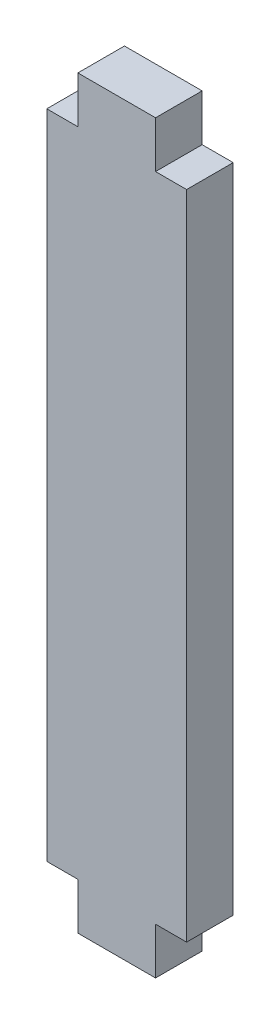
ISO-10303-21;
HEADER;
FILE_DESCRIPTION(('STEP AP214'),'2;1');
FILE_NAME('part.step','',(''),(''),'','','');
FILE_SCHEMA(('AUTOMOTIVE_DESIGN { 1 0 10303 214 1 1 1 1 }'));
ENDSEC;
DATA;
#1=APPLICATION_CONTEXT('core data for automotive mechanical design processes');
#2=APPLICATION_PROTOCOL_DEFINITION('international standard','automotive_design',2000,#1);
#3=PRODUCT_CONTEXT('',#1,'mechanical');
#4=PRODUCT('Part','Part','',(#3));
#5=PRODUCT_RELATED_PRODUCT_CATEGORY('part','',(#4));
#6=PRODUCT_DEFINITION_FORMATION('','',#4);
#7=PRODUCT_DEFINITION_CONTEXT('part definition',#1,'design');
#8=PRODUCT_DEFINITION('design','',#6,#7);
#9=PRODUCT_DEFINITION_SHAPE('','',#8);
#10=(LENGTH_UNIT() NAMED_UNIT(*) SI_UNIT(.MILLI.,.METRE.));
#11=(NAMED_UNIT(*) PLANE_ANGLE_UNIT() SI_UNIT($,.RADIAN.));
#12=(NAMED_UNIT(*) SI_UNIT($,.STERADIAN.) SOLID_ANGLE_UNIT());
#13=UNCERTAINTY_MEASURE_WITH_UNIT(LENGTH_MEASURE(1.E-05),#10,'distance_accuracy_value','');
#14=(GEOMETRIC_REPRESENTATION_CONTEXT(3) GLOBAL_UNCERTAINTY_ASSIGNED_CONTEXT((#13)) GLOBAL_UNIT_ASSIGNED_CONTEXT((#10,
#11,#12)) REPRESENTATION_CONTEXT('',''));
#15=CARTESIAN_POINT('',(0.,0.,0.));
#16=DIRECTION('',(0.,0.,1.));
#17=DIRECTION('',(1.,0.,0.));
#18=AXIS2_PLACEMENT_3D('',#15,#16,#17);
#19=CARTESIAN_POINT('',(0.,-20.975,3.));
#20=DIRECTION('',(0.,-1.,0.));
#21=DIRECTION('',(0.,0.,-1.));
#22=AXIS2_PLACEMENT_3D('',#19,#20,#21);
#23=PLANE('',#22);
#24=DIRECTION('',(-1.,0.,0.));
#25=VECTOR('',#24,1.);
#26=CARTESIAN_POINT('',(0.,-20.975,0.));
#27=LINE('',#26,#25);
#28=CARTESIAN_POINT('',(4.5,-20.975,0.));
#29=VERTEX_POINT('',#28);
#30=CARTESIAN_POINT('',(2.49999999999993,-20.975,0.));
#31=VERTEX_POINT('',#30);
#32=EDGE_CURVE('E206',#29,#31,#27,.T.);
#33=ORIENTED_EDGE('',*,*,#32,.F.);
#34=DIRECTION('',(0.,0.,-1.));
#35=VECTOR('',#34,1.);
#36=CARTESIAN_POINT('',(4.5,-20.975,3.));
#37=LINE('',#36,#35);
#38=CARTESIAN_POINT('',(4.5,-20.975,3.));
#39=VERTEX_POINT('',#38);
#40=EDGE_CURVE('E229',#39,#29,#37,.T.);
#41=ORIENTED_EDGE('',*,*,#40,.F.);
#42=DIRECTION('',(-1.,0.,0.));
#43=VECTOR('',#42,1.);
#44=CARTESIAN_POINT('',(0.,-20.975,3.));
#45=LINE('',#44,#43);
#46=CARTESIAN_POINT('',(2.49999999999993,-20.975,3.));
#47=VERTEX_POINT('',#46);
#48=EDGE_CURVE('E311',#39,#47,#45,.T.);
#49=ORIENTED_EDGE('',*,*,#48,.T.);
#50=DIRECTION('',(0.,0.,-1.));
#51=VECTOR('',#50,1.);
#52=CARTESIAN_POINT('',(2.49999999999993,-20.975,3.));
#53=LINE('',#52,#51);
#54=EDGE_CURVE('E233',#47,#31,#53,.T.);
#55=ORIENTED_EDGE('',*,*,#54,.T.);
#56=EDGE_LOOP('',(#33,#41,#49,#55));
#57=FACE_BOUND('',#56,.T.);
#58=ADVANCED_FACE('F77',(#57),#23,.T.);
#59=CARTESIAN_POINT('',(2.5,0.,3.));
#60=DIRECTION('',(-1.,0.,0.));
#61=DIRECTION('',(0.,-1.,0.));
#62=AXIS2_PLACEMENT_3D('',#59,#60,#61);
#63=PLANE('',#62);
#64=DIRECTION('',(0.,1.,0.));
#65=VECTOR('',#64,1.);
#66=CARTESIAN_POINT('',(2.5,0.,0.));
#67=LINE('',#66,#65);
#68=CARTESIAN_POINT('',(2.49999999999992,-23.975,0.));
#69=VERTEX_POINT('',#68);
#70=EDGE_CURVE('E214',#69,#31,#67,.T.);
#71=ORIENTED_EDGE('',*,*,#70,.T.);
#72=ORIENTED_EDGE('',*,*,#54,.F.);
#73=DIRECTION('',(0.,1.,0.));
#74=VECTOR('',#73,1.);
#75=CARTESIAN_POINT('',(2.5,0.,3.));
#76=LINE('',#75,#74);
#77=CARTESIAN_POINT('',(2.49999999999992,-23.975,3.));
#78=VERTEX_POINT('',#77);
#79=EDGE_CURVE('E315',#78,#47,#76,.T.);
#80=ORIENTED_EDGE('',*,*,#79,.F.);
#81=DIRECTION('',(0.,0.,-1.));
#82=VECTOR('',#81,1.);
#83=CARTESIAN_POINT('',(2.49999999999992,-23.975,3.));
#84=LINE('',#83,#82);
#85=EDGE_CURVE('E237',#78,#69,#84,.T.);
#86=ORIENTED_EDGE('',*,*,#85,.T.);
#87=EDGE_LOOP('',(#71,#72,#80,#86));
#88=FACE_BOUND('',#87,.T.);
#89=ADVANCED_FACE('F269',(#88),#63,.F.);
#90=CARTESIAN_POINT('',(0.,-23.975,3.));
#91=DIRECTION('',(0.,-1.,0.));
#92=DIRECTION('',(1.,0.,0.));
#93=AXIS2_PLACEMENT_3D('',#90,#91,#92);
#94=PLANE('',#93);
#95=DIRECTION('',(-1.,0.,0.));
#96=VECTOR('',#95,1.);
#97=CARTESIAN_POINT('',(0.,-23.975,0.));
#98=LINE('',#97,#96);
#99=CARTESIAN_POINT('',(-2.50000000000008,-23.975,0.));
#100=VERTEX_POINT('',#99);
#101=EDGE_CURVE('E210',#69,#100,#98,.T.);
#102=ORIENTED_EDGE('',*,*,#101,.F.);
#103=ORIENTED_EDGE('',*,*,#85,.F.);
#104=DIRECTION('',(-1.,0.,0.));
#105=VECTOR('',#104,1.);
#106=CARTESIAN_POINT('',(0.,-23.975,3.));
#107=LINE('',#106,#105);
#108=CARTESIAN_POINT('',(-2.50000000000008,-23.975,3.));
#109=VERTEX_POINT('',#108);
#110=EDGE_CURVE('E253',#78,#109,#107,.T.);
#111=ORIENTED_EDGE('',*,*,#110,.T.);
#112=DIRECTION('',(0.,0.,-1.));
#113=VECTOR('',#112,1.);
#114=CARTESIAN_POINT('',(-2.50000000000008,-23.975,3.));
#115=LINE('',#114,#113);
#116=EDGE_CURVE('E164',#109,#100,#115,.T.);
#117=ORIENTED_EDGE('',*,*,#116,.T.);
#118=EDGE_LOOP('',(#102,#103,#111,#117));
#119=FACE_BOUND('',#118,.T.);
#120=ADVANCED_FACE('F248',(#119),#94,.T.);
#121=CARTESIAN_POINT('',(-2.5,0.,3.));
#122=DIRECTION('',(-1.,0.,0.));
#123=DIRECTION('',(0.,-1.,0.));
#124=AXIS2_PLACEMENT_3D('',#121,#122,#123);
#125=PLANE('',#124);
#126=DIRECTION('',(0.,1.,0.));
#127=VECTOR('',#126,1.);
#128=CARTESIAN_POINT('',(-2.5,0.,0.));
#129=LINE('',#128,#127);
#130=CARTESIAN_POINT('',(-2.50000000000007,-20.975,0.));
#131=VERTEX_POINT('',#130);
#132=EDGE_CURVE('E205',#100,#131,#129,.T.);
#133=ORIENTED_EDGE('',*,*,#132,.F.);
#134=ORIENTED_EDGE('',*,*,#116,.F.);
#135=DIRECTION('',(0.,1.,0.));
#136=VECTOR('',#135,1.);
#137=CARTESIAN_POINT('',(-2.5,0.,3.));
#138=LINE('',#137,#136);
#139=CARTESIAN_POINT('',(-2.50000000000007,-20.975,3.));
#140=VERTEX_POINT('',#139);
#141=EDGE_CURVE('E309',#109,#140,#138,.T.);
#142=ORIENTED_EDGE('',*,*,#141,.T.);
#143=DIRECTION('',(0.,0.,-1.));
#144=VECTOR('',#143,1.);
#145=CARTESIAN_POINT('',(-2.50000000000007,-20.975,3.));
#146=LINE('',#145,#144);
#147=EDGE_CURVE('E155',#140,#131,#146,.T.);
#148=ORIENTED_EDGE('',*,*,#147,.T.);
#149=EDGE_LOOP('',(#133,#134,#142,#148));
#150=FACE_BOUND('',#149,.T.);
#151=ADVANCED_FACE('F259',(#150),#125,.T.);
#152=CARTESIAN_POINT('',(-4.5,-20.975,0.));
#153=VERTEX_POINT('',#152);
#154=EDGE_CURVE('E201',#131,#153,#27,.T.);
#155=ORIENTED_EDGE('',*,*,#154,.F.);
#156=ORIENTED_EDGE('',*,*,#147,.F.);
#157=CARTESIAN_POINT('',(-4.5,-20.975,3.));
#158=VERTEX_POINT('',#157);
#159=EDGE_CURVE('E304',#140,#158,#45,.T.);
#160=ORIENTED_EDGE('',*,*,#159,.T.);
#161=DIRECTION('',(0.,0.,-1.));
#162=VECTOR('',#161,1.);
#163=CARTESIAN_POINT('',(-4.5,-20.975,3.));
#164=LINE('',#163,#162);
#165=EDGE_CURVE('E149',#158,#153,#164,.T.);
#166=ORIENTED_EDGE('',*,*,#165,.T.);
#167=EDGE_LOOP('',(#155,#156,#160,#166));
#168=FACE_BOUND('',#167,.T.);
#169=ADVANCED_FACE('F307',(#168),#23,.T.);
#170=CARTESIAN_POINT('',(4.5,0.,3.));
#171=DIRECTION('',(-1.,0.,0.));
#172=DIRECTION('',(0.,0.,1.));
#173=AXIS2_PLACEMENT_3D('',#170,#171,#172);
#174=PLANE('',#173);
#175=DIRECTION('',(0.,1.,0.));
#176=VECTOR('',#175,1.);
#177=CARTESIAN_POINT('',(4.5,0.,0.));
#178=LINE('',#177,#176);
#179=CARTESIAN_POINT('',(4.5,20.975,0.));
#180=VERTEX_POINT('',#179);
#181=EDGE_CURVE('E218',#29,#180,#178,.T.);
#182=ORIENTED_EDGE('',*,*,#181,.T.);
#183=DIRECTION('',(0.,0.,-1.));
#184=VECTOR('',#183,1.);
#185=CARTESIAN_POINT('',(4.5,20.975,3.));
#186=LINE('',#185,#184);
#187=CARTESIAN_POINT('',(4.5,20.975,3.));
#188=VERTEX_POINT('',#187);
#189=EDGE_CURVE('E192',#188,#180,#186,.T.);
#190=ORIENTED_EDGE('',*,*,#189,.F.);
#191=DIRECTION('',(0.,1.,0.));
#192=VECTOR('',#191,1.);
#193=CARTESIAN_POINT('',(4.5,0.,3.));
#194=LINE('',#193,#192);
#195=EDGE_CURVE('E181',#39,#188,#194,.T.);
#196=ORIENTED_EDGE('',*,*,#195,.F.);
#197=ORIENTED_EDGE('',*,*,#40,.T.);
#198=EDGE_LOOP('',(#182,#190,#196,#197));
#199=FACE_BOUND('',#198,.T.);
#200=ADVANCED_FACE('F321',(#199),#174,.F.);
#201=CARTESIAN_POINT('',(-4.5,0.,3.));
#202=DIRECTION('',(-1.,0.,0.));
#203=DIRECTION('',(0.,0.,1.));
#204=AXIS2_PLACEMENT_3D('',#201,#202,#203);
#205=PLANE('',#204);
#206=DIRECTION('',(0.,1.,0.));
#207=VECTOR('',#206,1.);
#208=CARTESIAN_POINT('',(-4.5,0.,0.));
#209=LINE('',#208,#207);
#210=CARTESIAN_POINT('',(-4.5,20.975,0.));
#211=VERTEX_POINT('',#210);
#212=EDGE_CURVE('E198',#153,#211,#209,.T.);
#213=ORIENTED_EDGE('',*,*,#212,.F.);
#214=ORIENTED_EDGE('',*,*,#165,.F.);
#215=DIRECTION('',(0.,1.,0.));
#216=VECTOR('',#215,1.);
#217=CARTESIAN_POINT('',(-4.5,0.,3.));
#218=LINE('',#217,#216);
#219=CARTESIAN_POINT('',(-4.5,20.975,3.));
#220=VERTEX_POINT('',#219);
#221=EDGE_CURVE('E225',#158,#220,#218,.T.);
#222=ORIENTED_EDGE('',*,*,#221,.T.);
#223=DIRECTION('',(0.,0.,-1.));
#224=VECTOR('',#223,1.);
#225=CARTESIAN_POINT('',(-4.5,20.975,3.));
#226=LINE('',#225,#224);
#227=EDGE_CURVE('E186',#220,#211,#226,.T.);
#228=ORIENTED_EDGE('',*,*,#227,.T.);
#229=EDGE_LOOP('',(#213,#214,#222,#228));
#230=FACE_BOUND('',#229,.T.);
#231=ADVANCED_FACE('F302',(#230),#205,.T.);
#232=CARTESIAN_POINT('',(0.,0.,0.));
#233=DIRECTION('',(0.,0.,1.));
#234=DIRECTION('',(1.,0.,0.));
#235=AXIS2_PLACEMENT_3D('',#232,#233,#234);
#236=PLANE('',#235);
#237=ORIENTED_EDGE('',*,*,#212,.T.);
#238=DIRECTION('',(-1.,0.,0.));
#239=VECTOR('',#238,1.);
#240=CARTESIAN_POINT('',(0.,20.975,0.));
#241=LINE('',#240,#239);
#242=CARTESIAN_POINT('',(-2.5,20.975,0.));
#243=VERTEX_POINT('',#242);
#244=EDGE_CURVE('E222',#243,#211,#241,.T.);
#245=ORIENTED_EDGE('',*,*,#244,.F.);
#246=DIRECTION('',(0.,-1.,0.));
#247=VECTOR('',#246,1.);
#248=CARTESIAN_POINT('',(-2.5,23.975,0.));
#249=LINE('',#248,#247);
#250=CARTESIAN_POINT('',(-2.5,23.975,0.));
#251=VERTEX_POINT('',#250);
#252=EDGE_CURVE('E113',#251,#243,#249,.T.);
#253=ORIENTED_EDGE('',*,*,#252,.F.);
#254=DIRECTION('',(-1.,0.,0.));
#255=VECTOR('',#254,1.);
#256=CARTESIAN_POINT('',(2.5,23.975,0.));
#257=LINE('',#256,#255);
#258=CARTESIAN_POINT('',(2.5,23.975,0.));
#259=VERTEX_POINT('',#258);
#260=EDGE_CURVE('E121',#259,#251,#257,.T.);
#261=ORIENTED_EDGE('',*,*,#260,.F.);
#262=DIRECTION('',(0.,-1.,0.));
#263=VECTOR('',#262,1.);
#264=CARTESIAN_POINT('',(2.5,23.975,0.));
#265=LINE('',#264,#263);
#266=CARTESIAN_POINT('',(2.5,20.975,0.));
#267=VERTEX_POINT('',#266);
#268=EDGE_CURVE('E136',#259,#267,#265,.T.);
#269=ORIENTED_EDGE('',*,*,#268,.T.);
#270=EDGE_CURVE('E223',#180,#267,#241,.T.);
#271=ORIENTED_EDGE('',*,*,#270,.F.);
#272=ORIENTED_EDGE('',*,*,#181,.F.);
#273=ORIENTED_EDGE('',*,*,#32,.T.);
#274=ORIENTED_EDGE('',*,*,#70,.F.);
#275=ORIENTED_EDGE('',*,*,#101,.T.);
#276=ORIENTED_EDGE('',*,*,#132,.T.);
#277=ORIENTED_EDGE('',*,*,#154,.T.);
#278=EDGE_LOOP('',(#237,#245,#253,#261,#269,#271,#272,#273,#274,#275,#276,#277));
#279=FACE_BOUND('',#278,.T.);
#280=ADVANCED_FACE('F133',(#279),#236,.F.);
#281=CARTESIAN_POINT('',(0.,0.,3.));
#282=DIRECTION('',(0.,0.,1.));
#283=DIRECTION('',(1.,0.,0.));
#284=AXIS2_PLACEMENT_3D('',#281,#282,#283);
#285=PLANE('',#284);
#286=ORIENTED_EDGE('',*,*,#221,.F.);
#287=ORIENTED_EDGE('',*,*,#159,.F.);
#288=ORIENTED_EDGE('',*,*,#141,.F.);
#289=ORIENTED_EDGE('',*,*,#110,.F.);
#290=ORIENTED_EDGE('',*,*,#79,.T.);
#291=ORIENTED_EDGE('',*,*,#48,.F.);
#292=ORIENTED_EDGE('',*,*,#195,.T.);
#293=DIRECTION('',(-1.,0.,0.));
#294=VECTOR('',#293,1.);
#295=CARTESIAN_POINT('',(0.,20.975,3.));
#296=LINE('',#295,#294);
#297=CARTESIAN_POINT('',(2.5,20.975,3.));
#298=VERTEX_POINT('',#297);
#299=EDGE_CURVE('E175',#188,#298,#296,.T.);
#300=ORIENTED_EDGE('',*,*,#299,.T.);
#301=DIRECTION('',(0.,-1.,0.));
#302=VECTOR('',#301,1.);
#303=CARTESIAN_POINT('',(2.5,23.975,3.));
#304=LINE('',#303,#302);
#305=CARTESIAN_POINT('',(2.5,23.975,3.));
#306=VERTEX_POINT('',#305);
#307=EDGE_CURVE('E129',#306,#298,#304,.T.);
#308=ORIENTED_EDGE('',*,*,#307,.F.);
#309=DIRECTION('',(-1.,0.,0.));
#310=VECTOR('',#309,1.);
#311=CARTESIAN_POINT('',(2.5,23.975,3.));
#312=LINE('',#311,#310);
#313=CARTESIAN_POINT('',(-2.5,23.975,3.));
#314=VERTEX_POINT('',#313);
#315=EDGE_CURVE('E123',#306,#314,#312,.T.);
#316=ORIENTED_EDGE('',*,*,#315,.T.);
#317=DIRECTION('',(0.,-1.,0.));
#318=VECTOR('',#317,1.);
#319=CARTESIAN_POINT('',(-2.5,23.975,3.));
#320=LINE('',#319,#318);
#321=CARTESIAN_POINT('',(-2.5,20.975,3.));
#322=VERTEX_POINT('',#321);
#323=EDGE_CURVE('E145',#314,#322,#320,.T.);
#324=ORIENTED_EDGE('',*,*,#323,.T.);
#325=EDGE_CURVE('E187',#322,#220,#296,.T.);
#326=ORIENTED_EDGE('',*,*,#325,.T.);
#327=EDGE_LOOP('',(#286,#287,#288,#289,#290,#291,#292,#300,#308,#316,#324,#326));
#328=FACE_BOUND('',#327,.T.);
#329=ADVANCED_FACE('F177',(#328),#285,.T.);
#330=CARTESIAN_POINT('',(0.,20.975,3.));
#331=DIRECTION('',(0.,-1.,0.));
#332=DIRECTION('',(0.,0.,-1.));
#333=AXIS2_PLACEMENT_3D('',#330,#331,#332);
#334=PLANE('',#333);
#335=ORIENTED_EDGE('',*,*,#325,.F.);
#336=DIRECTION('',(0.,0.,-1.));
#337=VECTOR('',#336,1.);
#338=CARTESIAN_POINT('',(-2.5,20.975,3.));
#339=LINE('',#338,#337);
#340=EDGE_CURVE('E88',#322,#243,#339,.T.);
#341=ORIENTED_EDGE('',*,*,#340,.T.);
#342=ORIENTED_EDGE('',*,*,#244,.T.);
#343=ORIENTED_EDGE('',*,*,#227,.F.);
#344=EDGE_LOOP('',(#335,#341,#342,#343));
#345=FACE_BOUND('',#344,.T.);
#346=ADVANCED_FACE('F324',(#345),#334,.F.);
#347=DIRECTION('',(0.,0.,-1.));
#348=VECTOR('',#347,1.);
#349=CARTESIAN_POINT('',(2.5,20.975,3.));
#350=LINE('',#349,#348);
#351=EDGE_CURVE('E12',#298,#267,#350,.T.);
#352=ORIENTED_EDGE('',*,*,#351,.F.);
#353=ORIENTED_EDGE('',*,*,#299,.F.);
#354=ORIENTED_EDGE('',*,*,#189,.T.);
#355=ORIENTED_EDGE('',*,*,#270,.T.);
#356=EDGE_LOOP('',(#352,#353,#354,#355));
#357=FACE_BOUND('',#356,.T.);
#358=ADVANCED_FACE('F322',(#357),#334,.F.);
#359=CARTESIAN_POINT('',(2.5,23.975,3.));
#360=DIRECTION('',(0.,-1.,0.));
#361=DIRECTION('',(0.,0.,-1.));
#362=AXIS2_PLACEMENT_3D('',#359,#360,#361);
#363=PLANE('',#362);
#364=ORIENTED_EDGE('',*,*,#260,.T.);
#365=DIRECTION('',(0.,0.,-1.));
#366=VECTOR('',#365,1.);
#367=CARTESIAN_POINT('',(-2.5,23.975,3.));
#368=LINE('',#367,#366);
#369=EDGE_CURVE('E81',#314,#251,#368,.T.);
#370=ORIENTED_EDGE('',*,*,#369,.F.);
#371=ORIENTED_EDGE('',*,*,#315,.F.);
#372=DIRECTION('',(0.,0.,-1.));
#373=VECTOR('',#372,1.);
#374=CARTESIAN_POINT('',(2.5,23.975,3.));
#375=LINE('',#374,#373);
#376=EDGE_CURVE('E119',#306,#259,#375,.T.);
#377=ORIENTED_EDGE('',*,*,#376,.T.);
#378=EDGE_LOOP('',(#364,#370,#371,#377));
#379=FACE_BOUND('',#378,.T.);
#380=ADVANCED_FACE('F79',(#379),#363,.F.);
#381=CARTESIAN_POINT('',(-2.5,23.975,3.));
#382=DIRECTION('',(1.,0.,0.));
#383=DIRECTION('',(0.,1.,0.));
#384=AXIS2_PLACEMENT_3D('',#381,#382,#383);
#385=PLANE('',#384);
#386=ORIENTED_EDGE('',*,*,#252,.T.);
#387=ORIENTED_EDGE('',*,*,#340,.F.);
#388=ORIENTED_EDGE('',*,*,#323,.F.);
#389=ORIENTED_EDGE('',*,*,#369,.T.);
#390=EDGE_LOOP('',(#386,#387,#388,#389));
#391=FACE_BOUND('',#390,.T.);
#392=ADVANCED_FACE('F330',(#391),#385,.F.);
#393=CARTESIAN_POINT('',(2.5,23.975,3.));
#394=DIRECTION('',(1.,0.,0.));
#395=DIRECTION('',(0.,1.,0.));
#396=AXIS2_PLACEMENT_3D('',#393,#394,#395);
#397=PLANE('',#396);
#398=ORIENTED_EDGE('',*,*,#268,.F.);
#399=ORIENTED_EDGE('',*,*,#376,.F.);
#400=ORIENTED_EDGE('',*,*,#307,.T.);
#401=ORIENTED_EDGE('',*,*,#351,.T.);
#402=EDGE_LOOP('',(#398,#399,#400,#401));
#403=FACE_BOUND('',#402,.T.);
#404=ADVANCED_FACE('F140',(#403),#397,.T.);
#405=CLOSED_SHELL('',(#58,#89,#120,#151,#169,#200,#231,#280,#329,#346,#358,#380,#392,#404));
#406=MANIFOLD_SOLID_BREP('B2',#405);
#407=ADVANCED_BREP_SHAPE_REPRESENTATION('',(#18,#406),#14);
#408=SHAPE_DEFINITION_REPRESENTATION(#9,#407);
ENDSEC;
END-ISO-10303-21;
